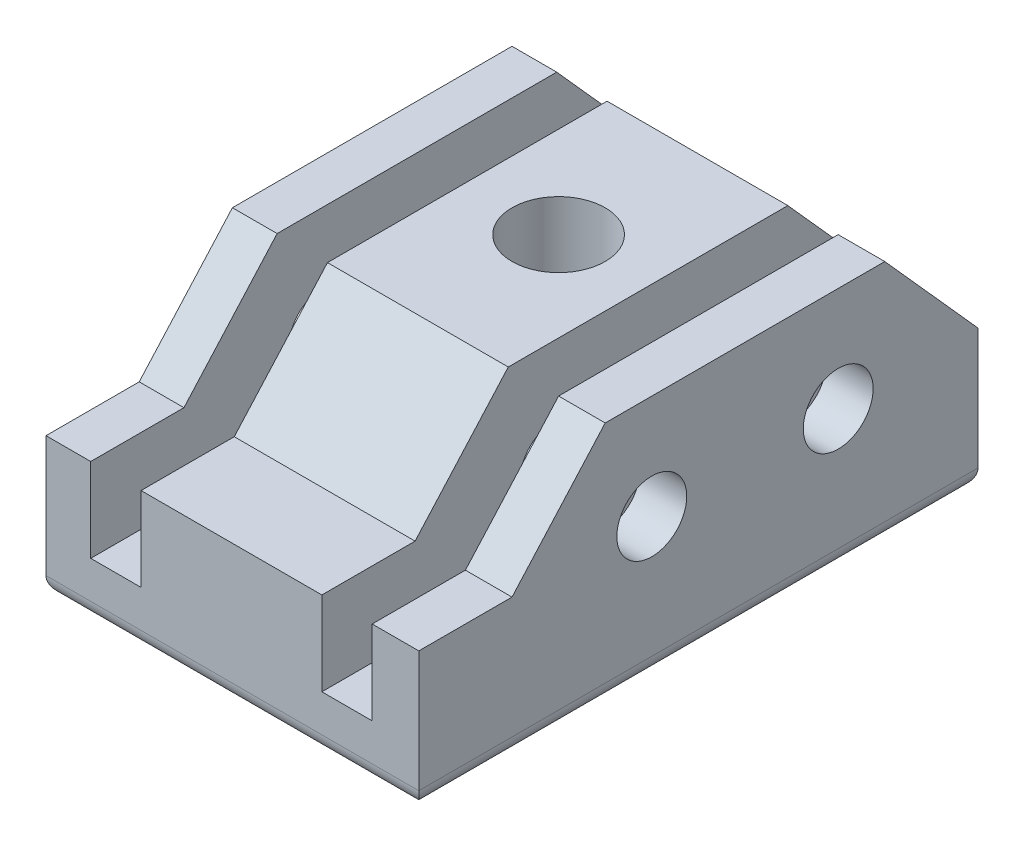
ISO-10303-21;
HEADER;
FILE_DESCRIPTION(('STEP AP214'),'2;1');
FILE_NAME('part.step','',(''),(''),'','','');
FILE_SCHEMA(('AUTOMOTIVE_DESIGN { 1 0 10303 214 1 1 1 1 }'));
ENDSEC;
DATA;
#1=APPLICATION_CONTEXT('core data for automotive mechanical design processes');
#2=APPLICATION_PROTOCOL_DEFINITION('international standard','automotive_design',2000,#1);
#3=PRODUCT_CONTEXT('',#1,'mechanical');
#4=PRODUCT('Part','Part','',(#3));
#5=PRODUCT_RELATED_PRODUCT_CATEGORY('part','',(#4));
#6=PRODUCT_DEFINITION_FORMATION('','',#4);
#7=PRODUCT_DEFINITION_CONTEXT('part definition',#1,'design');
#8=PRODUCT_DEFINITION('design','',#6,#7);
#9=PRODUCT_DEFINITION_SHAPE('','',#8);
#10=(LENGTH_UNIT() NAMED_UNIT(*) SI_UNIT(.MILLI.,.METRE.));
#11=(NAMED_UNIT(*) PLANE_ANGLE_UNIT() SI_UNIT($,.RADIAN.));
#12=(NAMED_UNIT(*) SI_UNIT($,.STERADIAN.) SOLID_ANGLE_UNIT());
#13=UNCERTAINTY_MEASURE_WITH_UNIT(LENGTH_MEASURE(1.E-05),#10,'distance_accuracy_value','');
#14=(GEOMETRIC_REPRESENTATION_CONTEXT(3) GLOBAL_UNCERTAINTY_ASSIGNED_CONTEXT((#13)) GLOBAL_UNIT_ASSIGNED_CONTEXT((#10,
#11,#12)) REPRESENTATION_CONTEXT('',''));
#15=CARTESIAN_POINT('',(0.,0.,0.));
#16=DIRECTION('',(0.,0.,1.));
#17=DIRECTION('',(1.,0.,0.));
#18=AXIS2_PLACEMENT_3D('',#15,#16,#17);
#19=CARTESIAN_POINT('',(-50.8,19.05,0.));
#20=DIRECTION('',(0.,0.666666666666667,0.74535599249993));
#21=DIRECTION('',(0.,-0.74535599249993,0.666666666666667));
#22=AXIS2_PLACEMENT_3D('',#19,#20,#21);
#23=PLANE('',#22);
#24=DIRECTION('',(0.,-0.74535599249993,0.666666666666667));
#25=VECTOR('',#24,1.);
#26=CARTESIAN_POINT('',(-44.704,19.05,0.));
#27=LINE('',#26,#25);
#28=CARTESIAN_POINT('',(-44.704,33.2490316571237,-12.7));
#29=VERTEX_POINT('',#28);
#30=CARTESIAN_POINT('',(-44.704,19.05,0.));
#31=VERTEX_POINT('',#30);
#32=EDGE_CURVE('E347',#29,#31,#27,.T.);
#33=ORIENTED_EDGE('',*,*,#32,.F.);
#34=DIRECTION('',(1.,0.,0.));
#35=VECTOR('',#34,1.);
#36=CARTESIAN_POINT('',(-50.8,33.2490316571237,-12.7));
#37=LINE('',#36,#35);
#38=CARTESIAN_POINT('',(-50.8,33.2490316571237,-12.7));
#39=VERTEX_POINT('',#38);
#40=EDGE_CURVE('E410',#39,#29,#37,.T.);
#41=ORIENTED_EDGE('',*,*,#40,.F.);
#42=DIRECTION('',(0.,-0.74535599249993,0.666666666666667));
#43=VECTOR('',#42,1.);
#44=CARTESIAN_POINT('',(-50.8,19.05,0.));
#45=LINE('',#44,#43);
#46=CARTESIAN_POINT('',(-50.8,19.05,0.));
#47=VERTEX_POINT('',#46);
#48=EDGE_CURVE('E391',#39,#47,#45,.T.);
#49=ORIENTED_EDGE('',*,*,#48,.T.);
#50=DIRECTION('',(1.,0.,0.));
#51=VECTOR('',#50,1.);
#52=CARTESIAN_POINT('',(-50.8,19.05,0.));
#53=LINE('',#52,#51);
#54=EDGE_CURVE('E403',#47,#31,#53,.T.);
#55=ORIENTED_EDGE('',*,*,#54,.T.);
#56=EDGE_LOOP('',(#33,#41,#49,#55));
#57=FACE_BOUND('',#56,.T.);
#58=ADVANCED_FACE('F41',(#57),#23,.T.);
#59=CARTESIAN_POINT('',(-50.8,33.2490316571237,-12.7));
#60=DIRECTION('',(0.,1.,0.));
#61=DIRECTION('',(0.,0.,1.));
#62=AXIS2_PLACEMENT_3D('',#59,#60,#61);
#63=PLANE('',#62);
#64=DIRECTION('',(0.,0.,-1.));
#65=VECTOR('',#64,1.);
#66=CARTESIAN_POINT('',(-44.704,33.2490316571237,0.));
#67=LINE('',#66,#65);
#68=CARTESIAN_POINT('',(-44.704,33.2490316571237,-50.8));
#69=VERTEX_POINT('',#68);
#70=EDGE_CURVE('E324',#29,#69,#67,.T.);
#71=ORIENTED_EDGE('',*,*,#70,.T.);
#72=DIRECTION('',(1.,0.,0.));
#73=VECTOR('',#72,1.);
#74=CARTESIAN_POINT('',(-50.8,33.2490316571237,-50.8));
#75=LINE('',#74,#73);
#76=CARTESIAN_POINT('',(-50.8,33.2490316571237,-50.8));
#77=VERTEX_POINT('',#76);
#78=EDGE_CURVE('E416',#77,#69,#75,.T.);
#79=ORIENTED_EDGE('',*,*,#78,.F.);
#80=DIRECTION('',(0.,0.,1.));
#81=VECTOR('',#80,1.);
#82=CARTESIAN_POINT('',(-50.8,33.2490316571237,-12.7));
#83=LINE('',#82,#81);
#84=EDGE_CURVE('E387',#77,#39,#83,.T.);
#85=ORIENTED_EDGE('',*,*,#84,.T.);
#86=ORIENTED_EDGE('',*,*,#40,.T.);
#87=EDGE_LOOP('',(#71,#79,#85,#86));
#88=FACE_BOUND('',#87,.T.);
#89=ADVANCED_FACE('F562',(#88),#63,.T.);
#90=CARTESIAN_POINT('',(-50.8,33.2490316571237,-50.8));
#91=DIRECTION('',(0.,0.666666666666666,-0.74535599249993));
#92=DIRECTION('',(0.,0.74535599249993,0.666666666666666));
#93=AXIS2_PLACEMENT_3D('',#90,#91,#92);
#94=PLANE('',#93);
#95=DIRECTION('',(0.,0.74535599249993,0.666666666666666));
#96=VECTOR('',#95,1.);
#97=CARTESIAN_POINT('',(-44.704,33.2490316571237,-50.8));
#98=LINE('',#97,#96);
#99=CARTESIAN_POINT('',(-44.704,19.05,-63.5));
#100=VERTEX_POINT('',#99);
#101=EDGE_CURVE('E344',#100,#69,#98,.T.);
#102=ORIENTED_EDGE('',*,*,#101,.F.);
#103=DIRECTION('',(1.,0.,0.));
#104=VECTOR('',#103,1.);
#105=CARTESIAN_POINT('',(-50.8,19.05,-63.5));
#106=LINE('',#105,#104);
#107=CARTESIAN_POINT('',(-50.8,19.05,-63.5));
#108=VERTEX_POINT('',#107);
#109=EDGE_CURVE('E422',#108,#100,#106,.T.);
#110=ORIENTED_EDGE('',*,*,#109,.F.);
#111=DIRECTION('',(0.,0.74535599249993,0.666666666666666));
#112=VECTOR('',#111,1.);
#113=CARTESIAN_POINT('',(-50.8,33.2490316571237,-50.8));
#114=LINE('',#113,#112);
#115=EDGE_CURVE('E383',#108,#77,#114,.T.);
#116=ORIENTED_EDGE('',*,*,#115,.T.);
#117=ORIENTED_EDGE('',*,*,#78,.T.);
#118=EDGE_LOOP('',(#102,#110,#116,#117));
#119=FACE_BOUND('',#118,.T.);
#120=ADVANCED_FACE('F570',(#119),#94,.T.);
#121=DIRECTION('',(0.,0.74535599249993,-0.666666666666667));
#122=VECTOR('',#121,1.);
#123=CARTESIAN_POINT('',(-37.846,19.05,0.));
#124=LINE('',#123,#122);
#125=CARTESIAN_POINT('',(-37.846,19.05,0.));
#126=VERTEX_POINT('',#125);
#127=CARTESIAN_POINT('',(-37.846,33.2490316571237,-12.7));
#128=VERTEX_POINT('',#127);
#129=EDGE_CURVE('E341',#126,#128,#124,.T.);
#130=ORIENTED_EDGE('',*,*,#129,.F.);
#131=CARTESIAN_POINT('',(-13.208,19.05,0.));
#132=VERTEX_POINT('',#131);
#133=EDGE_CURVE('E408',#126,#132,#53,.T.);
#134=ORIENTED_EDGE('',*,*,#133,.T.);
#135=DIRECTION('',(0.,-0.74535599249993,0.666666666666667));
#136=VECTOR('',#135,1.);
#137=CARTESIAN_POINT('',(-13.208,19.05,0.));
#138=LINE('',#137,#136);
#139=CARTESIAN_POINT('',(-13.208,33.2490316571237,-12.7));
#140=VERTEX_POINT('',#139);
#141=EDGE_CURVE('E378',#140,#132,#138,.T.);
#142=ORIENTED_EDGE('',*,*,#141,.F.);
#143=EDGE_CURVE('E414',#128,#140,#37,.T.);
#144=ORIENTED_EDGE('',*,*,#143,.F.);
#145=EDGE_LOOP('',(#130,#134,#142,#144));
#146=FACE_BOUND('',#145,.T.);
#147=ADVANCED_FACE('F565',(#146),#23,.T.);
#148=CARTESIAN_POINT('',(-25.4,33.2490316571237,-31.75));
#149=DIRECTION('',(0.,1.,0.));
#150=DIRECTION('',(0.,0.,1.));
#151=AXIS2_PLACEMENT_3D('',#148,#149,#150);
#152=CIRCLE('',#151,6.35);
#153=CARTESIAN_POINT('',(-25.4,33.2490316571237,-25.4));
#154=VERTEX_POINT('',#153);
#155=EDGE_CURVE('E483',#154,#154,#152,.T.);
#156=ORIENTED_EDGE('',*,*,#155,.F.);
#157=EDGE_LOOP('',(#156));
#158=FACE_BOUND('',#157,.T.);
#159=DIRECTION('',(0.,0.,-1.));
#160=VECTOR('',#159,1.);
#161=CARTESIAN_POINT('',(-37.846,33.2490316571237,0.));
#162=LINE('',#161,#160);
#163=CARTESIAN_POINT('',(-37.846,33.2490316571237,-50.8));
#164=VERTEX_POINT('',#163);
#165=EDGE_CURVE('E333',#128,#164,#162,.T.);
#166=ORIENTED_EDGE('',*,*,#165,.F.);
#167=ORIENTED_EDGE('',*,*,#143,.T.);
#168=DIRECTION('',(0.,0.,-1.));
#169=VECTOR('',#168,1.);
#170=CARTESIAN_POINT('',(-13.208,33.2490316571237,0.));
#171=LINE('',#170,#169);
#172=CARTESIAN_POINT('',(-13.208,33.2490316571237,-50.8));
#173=VERTEX_POINT('',#172);
#174=EDGE_CURVE('E361',#140,#173,#171,.T.);
#175=ORIENTED_EDGE('',*,*,#174,.T.);
#176=EDGE_CURVE('E420',#164,#173,#75,.T.);
#177=ORIENTED_EDGE('',*,*,#176,.F.);
#178=EDGE_LOOP('',(#166,#167,#175,#177));
#179=FACE_BOUND('',#178,.T.);
#180=ADVANCED_FACE('F573',(#158,#179),#63,.T.);
#181=DIRECTION('',(0.,-0.74535599249993,-0.666666666666666));
#182=VECTOR('',#181,1.);
#183=CARTESIAN_POINT('',(-37.846,33.2490316571237,-50.8));
#184=LINE('',#183,#182);
#185=CARTESIAN_POINT('',(-37.846,19.05,-63.5));
#186=VERTEX_POINT('',#185);
#187=EDGE_CURVE('E328',#164,#186,#184,.T.);
#188=ORIENTED_EDGE('',*,*,#187,.F.);
#189=ORIENTED_EDGE('',*,*,#176,.T.);
#190=DIRECTION('',(0.,0.74535599249993,0.666666666666666));
#191=VECTOR('',#190,1.);
#192=CARTESIAN_POINT('',(-13.208,33.2490316571237,-50.8));
#193=LINE('',#192,#191);
#194=CARTESIAN_POINT('',(-13.208,19.05,-63.5));
#195=VERTEX_POINT('',#194);
#196=EDGE_CURVE('E435',#195,#173,#193,.T.);
#197=ORIENTED_EDGE('',*,*,#196,.F.);
#198=EDGE_CURVE('E426',#186,#195,#106,.T.);
#199=ORIENTED_EDGE('',*,*,#198,.F.);
#200=EDGE_LOOP('',(#188,#189,#197,#199));
#201=FACE_BOUND('',#200,.T.);
#202=ADVANCED_FACE('F656',(#201),#94,.T.);
#203=CARTESIAN_POINT('',(-50.8,0.,-63.5));
#204=DIRECTION('',(0.,0.,-1.));
#205=DIRECTION('',(-1.,0.,0.));
#206=AXIS2_PLACEMENT_3D('',#203,#204,#205);
#207=PLANE('',#206);
#208=DIRECTION('',(0.,1.,0.));
#209=VECTOR('',#208,1.);
#210=CARTESIAN_POINT('',(0.,0.,-63.5));
#211=LINE('',#210,#209);
#212=CARTESIAN_POINT('',(0.,2.54,-63.5));
#213=VERTEX_POINT('',#212);
#214=CARTESIAN_POINT('',(0.,19.05,-63.5));
#215=VERTEX_POINT('',#214);
#216=EDGE_CURVE('E407',#213,#215,#211,.T.);
#217=ORIENTED_EDGE('',*,*,#216,.F.);
#218=DIRECTION('',(1.,0.,0.));
#219=VECTOR('',#218,1.);
#220=CARTESIAN_POINT('',(-50.8,2.54,-63.5));
#221=LINE('',#220,#219);
#222=CARTESIAN_POINT('',(-50.8,2.54,-63.5));
#223=VERTEX_POINT('',#222);
#224=EDGE_CURVE('E461',#213,#223,#221,.F.);
#225=ORIENTED_EDGE('',*,*,#224,.T.);
#226=DIRECTION('',(0.,1.,0.));
#227=VECTOR('',#226,1.);
#228=CARTESIAN_POINT('',(-50.8,0.,-63.5));
#229=LINE('',#228,#227);
#230=EDGE_CURVE('E427',#223,#108,#229,.T.);
#231=ORIENTED_EDGE('',*,*,#230,.T.);
#232=ORIENTED_EDGE('',*,*,#109,.T.);
#233=DIRECTION('',(0.,1.,0.));
#234=VECTOR('',#233,1.);
#235=CARTESIAN_POINT('',(-44.704,7.62,-63.5));
#236=LINE('',#235,#234);
#237=CARTESIAN_POINT('',(-44.704,7.62,-63.5));
#238=VERTEX_POINT('',#237);
#239=EDGE_CURVE('E317',#238,#100,#236,.T.);
#240=ORIENTED_EDGE('',*,*,#239,.F.);
#241=DIRECTION('',(-1.,0.,0.));
#242=VECTOR('',#241,1.);
#243=CARTESIAN_POINT('',(-37.846,7.62,-63.5));
#244=LINE('',#243,#242);
#245=CARTESIAN_POINT('',(-37.846,7.62,-63.5));
#246=VERTEX_POINT('',#245);
#247=EDGE_CURVE('E320',#246,#238,#244,.T.);
#248=ORIENTED_EDGE('',*,*,#247,.F.);
#249=DIRECTION('',(0.,-1.,0.));
#250=VECTOR('',#249,1.);
#251=CARTESIAN_POINT('',(-37.846,0.,-63.5));
#252=LINE('',#251,#250);
#253=EDGE_CURVE('E439',#186,#246,#252,.T.);
#254=ORIENTED_EDGE('',*,*,#253,.F.);
#255=ORIENTED_EDGE('',*,*,#198,.T.);
#256=DIRECTION('',(0.,1.,0.));
#257=VECTOR('',#256,1.);
#258=CARTESIAN_POINT('',(-13.208,7.62,-63.5));
#259=LINE('',#258,#257);
#260=CARTESIAN_POINT('',(-13.208,7.62,-63.5));
#261=VERTEX_POINT('',#260);
#262=EDGE_CURVE('E350',#261,#195,#259,.T.);
#263=ORIENTED_EDGE('',*,*,#262,.F.);
#264=DIRECTION('',(-1.,0.,0.));
#265=VECTOR('',#264,1.);
#266=CARTESIAN_POINT('',(-6.35,7.62,-63.5));
#267=LINE('',#266,#265);
#268=CARTESIAN_POINT('',(-6.35,7.62,-63.5));
#269=VERTEX_POINT('',#268);
#270=EDGE_CURVE('E357',#269,#261,#267,.T.);
#271=ORIENTED_EDGE('',*,*,#270,.F.);
#272=DIRECTION('',(0.,-1.,0.));
#273=VECTOR('',#272,1.);
#274=CARTESIAN_POINT('',(-6.35,7.62,-63.5));
#275=LINE('',#274,#273);
#276=CARTESIAN_POINT('',(-6.35,19.05,-63.5));
#277=VERTEX_POINT('',#276);
#278=EDGE_CURVE('E354',#277,#269,#275,.T.);
#279=ORIENTED_EDGE('',*,*,#278,.F.);
#280=EDGE_CURVE('E394',#277,#215,#106,.T.);
#281=ORIENTED_EDGE('',*,*,#280,.T.);
#282=EDGE_LOOP('',(#217,#225,#231,#232,#240,#248,#254,#255,#263,#271,#279,#281));
#283=FACE_BOUND('',#282,.T.);
#284=ADVANCED_FACE('F540',(#283),#207,.T.);
#285=CARTESIAN_POINT('',(-50.8,0.,0.));
#286=DIRECTION('',(0.,-1.,0.));
#287=DIRECTION('',(0.,0.,-1.));
#288=AXIS2_PLACEMENT_3D('',#285,#286,#287);
#289=PLANE('',#288);
#290=CARTESIAN_POINT('',(-30.4,0.,3.34999999999999));
#291=DIRECTION('',(0.,-1.,0.));
#292=DIRECTION('',(0.,0.,-1.));
#293=AXIS2_PLACEMENT_3D('',#290,#291,#292);
#294=CIRCLE('',#293,3.05);
#295=CARTESIAN_POINT('',(-30.4,0.,0.29999999999999));
#296=VERTEX_POINT('',#295);
#297=EDGE_CURVE('E503',#296,#296,#294,.T.);
#298=ORIENTED_EDGE('',*,*,#297,.F.);
#299=EDGE_LOOP('',(#298));
#300=FACE_BOUND('',#299,.T.);
#301=CARTESIAN_POINT('',(-20.4,0.,3.34999999999999));
#302=DIRECTION('',(0.,-1.,0.));
#303=DIRECTION('',(0.,0.,-1.));
#304=AXIS2_PLACEMENT_3D('',#301,#302,#303);
#305=CIRCLE('',#304,3.05);
#306=CARTESIAN_POINT('',(-20.4,0.,0.29999999999999));
#307=VERTEX_POINT('',#306);
#308=EDGE_CURVE('E511',#307,#307,#305,.T.);
#309=ORIENTED_EDGE('',*,*,#308,.F.);
#310=EDGE_LOOP('',(#309));
#311=FACE_BOUND('',#310,.T.);
#312=CARTESIAN_POINT('',(-20.4,0.,-46.15));
#313=DIRECTION('',(0.,-1.,0.));
#314=DIRECTION('',(0.,0.,-1.));
#315=AXIS2_PLACEMENT_3D('',#312,#313,#314);
#316=CIRCLE('',#315,3.05);
#317=CARTESIAN_POINT('',(-20.4,0.,-49.2));
#318=VERTEX_POINT('',#317);
#319=EDGE_CURVE('E519',#318,#318,#316,.T.);
#320=ORIENTED_EDGE('',*,*,#319,.F.);
#321=EDGE_LOOP('',(#320));
#322=FACE_BOUND('',#321,.T.);
#323=CARTESIAN_POINT('',(-30.4,0.,-46.15));
#324=DIRECTION('',(0.,-1.,0.));
#325=DIRECTION('',(0.,0.,-1.));
#326=AXIS2_PLACEMENT_3D('',#323,#324,#325);
#327=CIRCLE('',#326,3.05);
#328=CARTESIAN_POINT('',(-30.4,0.,-49.2));
#329=VERTEX_POINT('',#328);
#330=EDGE_CURVE('E495',#329,#329,#327,.T.);
#331=ORIENTED_EDGE('',*,*,#330,.F.);
#332=EDGE_LOOP('',(#331));
#333=FACE_BOUND('',#332,.T.);
#334=DIRECTION('',(0.,0.,-1.));
#335=VECTOR('',#334,1.);
#336=CARTESIAN_POINT('',(-48.26,0.,0.));
#337=LINE('',#336,#335);
#338=CARTESIAN_POINT('',(-48.26,0.,10.16));
#339=VERTEX_POINT('',#338);
#340=CARTESIAN_POINT('',(-48.26,0.,-60.96));
#341=VERTEX_POINT('',#340);
#342=EDGE_CURVE('E454',#339,#341,#337,.T.);
#343=ORIENTED_EDGE('',*,*,#342,.T.);
#344=DIRECTION('',(1.,0.,0.));
#345=VECTOR('',#344,1.);
#346=CARTESIAN_POINT('',(-50.8,0.,-60.96));
#347=LINE('',#346,#345);
#348=CARTESIAN_POINT('',(-2.54,0.,-60.96));
#349=VERTEX_POINT('',#348);
#350=EDGE_CURVE('E457',#341,#349,#347,.T.);
#351=ORIENTED_EDGE('',*,*,#350,.T.);
#352=DIRECTION('',(0.,0.,-1.));
#353=VECTOR('',#352,1.);
#354=CARTESIAN_POINT('',(-2.54,0.,12.7));
#355=LINE('',#354,#353);
#356=CARTESIAN_POINT('',(-2.54,0.,10.16));
#357=VERTEX_POINT('',#356);
#358=EDGE_CURVE('E442',#349,#357,#355,.F.);
#359=ORIENTED_EDGE('',*,*,#358,.T.);
#360=DIRECTION('',(1.,0.,0.));
#361=VECTOR('',#360,1.);
#362=CARTESIAN_POINT('',(-50.8,0.,10.16));
#363=LINE('',#362,#361);
#364=EDGE_CURVE('E451',#357,#339,#363,.F.);
#365=ORIENTED_EDGE('',*,*,#364,.T.);
#366=EDGE_LOOP('',(#343,#351,#359,#365));
#367=FACE_BOUND('',#366,.T.);
#368=CARTESIAN_POINT('',(-25.4,0.,-31.75));
#369=DIRECTION('',(0.,1.,0.));
#370=DIRECTION('',(0.,0.,1.));
#371=AXIS2_PLACEMENT_3D('',#368,#369,#370);
#372=CIRCLE('',#371,6.35);
#373=CARTESIAN_POINT('',(-25.4,0.,-25.4));
#374=VERTEX_POINT('',#373);
#375=EDGE_CURVE('E206',#374,#374,#372,.T.);
#376=ORIENTED_EDGE('',*,*,#375,.T.);
#377=EDGE_LOOP('',(#376));
#378=FACE_BOUND('',#377,.T.);
#379=ADVANCED_FACE('F536',(#300,#311,#322,#333,#367,#378),#289,.T.);
#380=CARTESIAN_POINT('',(-50.8,0.,0.));
#381=DIRECTION('',(-1.,0.,0.));
#382=DIRECTION('',(0.,0.,1.));
#383=AXIS2_PLACEMENT_3D('',#380,#381,#382);
#384=PLANE('',#383);
#385=CARTESIAN_POINT('',(-50.8,19.05,-19.05));
#386=DIRECTION('',(1.,0.,0.));
#387=DIRECTION('',(0.,0.,-1.));
#388=AXIS2_PLACEMENT_3D('',#385,#386,#387);
#389=CIRCLE('',#388,4.7625);
#390=CARTESIAN_POINT('',(-50.8,19.05,-23.8125));
#391=VERTEX_POINT('',#390);
#392=EDGE_CURVE('E276',#391,#391,#389,.T.);
#393=ORIENTED_EDGE('',*,*,#392,.T.);
#394=EDGE_LOOP('',(#393));
#395=FACE_BOUND('',#394,.T.);
#396=CARTESIAN_POINT('',(-50.8,19.05,-44.45));
#397=DIRECTION('',(1.,0.,0.));
#398=DIRECTION('',(0.,0.,-1.));
#399=AXIS2_PLACEMENT_3D('',#396,#397,#398);
#400=CIRCLE('',#399,4.7625);
#401=CARTESIAN_POINT('',(-50.8,19.05,-49.2125));
#402=VERTEX_POINT('',#401);
#403=EDGE_CURVE('E285',#402,#402,#400,.T.);
#404=ORIENTED_EDGE('',*,*,#403,.T.);
#405=EDGE_LOOP('',(#404));
#406=FACE_BOUND('',#405,.T.);
#407=ORIENTED_EDGE('',*,*,#230,.F.);
#408=DIRECTION('',(0.,0.,-1.));
#409=VECTOR('',#408,1.);
#410=CARTESIAN_POINT('',(-50.8,2.54,0.));
#411=LINE('',#410,#409);
#412=CARTESIAN_POINT('',(-50.8,2.54,12.7));
#413=VERTEX_POINT('',#412);
#414=EDGE_CURVE('E66',#223,#413,#411,.F.);
#415=ORIENTED_EDGE('',*,*,#414,.T.);
#416=DIRECTION('',(0.,-1.,0.));
#417=VECTOR('',#416,1.);
#418=CARTESIAN_POINT('',(-50.8,7.61999999999999,12.7));
#419=LINE('',#418,#417);
#420=CARTESIAN_POINT('',(-50.8,19.05,12.7));
#421=VERTEX_POINT('',#420);
#422=EDGE_CURVE('E255',#421,#413,#419,.T.);
#423=ORIENTED_EDGE('',*,*,#422,.F.);
#424=DIRECTION('',(0.,0.,-1.));
#425=VECTOR('',#424,1.);
#426=CARTESIAN_POINT('',(-50.8,19.05,12.7));
#427=LINE('',#426,#425);
#428=EDGE_CURVE('E258',#421,#47,#427,.T.);
#429=ORIENTED_EDGE('',*,*,#428,.T.);
#430=ORIENTED_EDGE('',*,*,#48,.F.);
#431=ORIENTED_EDGE('',*,*,#84,.F.);
#432=ORIENTED_EDGE('',*,*,#115,.F.);
#433=EDGE_LOOP('',(#407,#415,#423,#429,#430,#431,#432));
#434=FACE_BOUND('',#433,.T.);
#435=ADVANCED_FACE('F539',(#395,#406,#434),#384,.T.);
#436=CARTESIAN_POINT('',(0.,0.,0.));
#437=DIRECTION('',(-1.,0.,0.));
#438=DIRECTION('',(0.,0.,1.));
#439=AXIS2_PLACEMENT_3D('',#436,#437,#438);
#440=PLANE('',#439);
#441=CARTESIAN_POINT('',(0.,19.05,-19.05));
#442=DIRECTION('',(1.,0.,0.));
#443=DIRECTION('',(0.,0.,-1.));
#444=AXIS2_PLACEMENT_3D('',#441,#442,#443);
#445=CIRCLE('',#444,4.7625);
#446=CARTESIAN_POINT('',(0.,19.05,-23.8125));
#447=VERTEX_POINT('',#446);
#448=EDGE_CURVE('E281',#447,#447,#445,.T.);
#449=ORIENTED_EDGE('',*,*,#448,.F.);
#450=EDGE_LOOP('',(#449));
#451=FACE_BOUND('',#450,.T.);
#452=CARTESIAN_POINT('',(0.,19.05,-44.45));
#453=DIRECTION('',(1.,0.,0.));
#454=DIRECTION('',(0.,0.,-1.));
#455=AXIS2_PLACEMENT_3D('',#452,#453,#454);
#456=CIRCLE('',#455,4.7625);
#457=CARTESIAN_POINT('',(0.,19.05,-49.2125));
#458=VERTEX_POINT('',#457);
#459=EDGE_CURVE('E218',#458,#458,#456,.T.);
#460=ORIENTED_EDGE('',*,*,#459,.F.);
#461=EDGE_LOOP('',(#460));
#462=FACE_BOUND('',#461,.T.);
#463=DIRECTION('',(0.,1.,0.));
#464=VECTOR('',#463,1.);
#465=CARTESIAN_POINT('',(0.,0.,12.7));
#466=LINE('',#465,#464);
#467=CARTESIAN_POINT('',(0.,2.54,12.7));
#468=VERTEX_POINT('',#467);
#469=CARTESIAN_POINT('',(0.,19.05,12.7));
#470=VERTEX_POINT('',#469);
#471=EDGE_CURVE('E196',#468,#470,#466,.T.);
#472=ORIENTED_EDGE('',*,*,#471,.F.);
#473=DIRECTION('',(0.,0.,-1.));
#474=VECTOR('',#473,1.);
#475=CARTESIAN_POINT('',(0.,2.54,-63.5));
#476=LINE('',#475,#474);
#477=EDGE_CURVE('E11',#468,#213,#476,.T.);
#478=ORIENTED_EDGE('',*,*,#477,.T.);
#479=ORIENTED_EDGE('',*,*,#216,.T.);
#480=DIRECTION('',(0.,0.74535599249993,0.666666666666666));
#481=VECTOR('',#480,1.);
#482=CARTESIAN_POINT('',(0.,33.2490316571237,-50.8));
#483=LINE('',#482,#481);
#484=CARTESIAN_POINT('',(0.,33.2490316571237,-50.8));
#485=VERTEX_POINT('',#484);
#486=EDGE_CURVE('E382',#215,#485,#483,.T.);
#487=ORIENTED_EDGE('',*,*,#486,.T.);
#488=DIRECTION('',(0.,0.,1.));
#489=VECTOR('',#488,1.);
#490=CARTESIAN_POINT('',(0.,33.2490316571237,-12.7));
#491=LINE('',#490,#489);
#492=CARTESIAN_POINT('',(0.,33.2490316571237,-12.7));
#493=VERTEX_POINT('',#492);
#494=EDGE_CURVE('E398',#485,#493,#491,.T.);
#495=ORIENTED_EDGE('',*,*,#494,.T.);
#496=DIRECTION('',(0.,-0.74535599249993,0.666666666666667));
#497=VECTOR('',#496,1.);
#498=CARTESIAN_POINT('',(0.,19.05,0.));
#499=LINE('',#498,#497);
#500=CARTESIAN_POINT('',(0.,19.05,0.));
#501=VERTEX_POINT('',#500);
#502=EDGE_CURVE('E214',#493,#501,#499,.T.);
#503=ORIENTED_EDGE('',*,*,#502,.T.);
#504=DIRECTION('',(0.,0.,-1.));
#505=VECTOR('',#504,1.);
#506=CARTESIAN_POINT('',(0.,19.05,12.7));
#507=LINE('',#506,#505);
#508=EDGE_CURVE('E210',#470,#501,#507,.T.);
#509=ORIENTED_EDGE('',*,*,#508,.F.);
#510=EDGE_LOOP('',(#472,#478,#479,#487,#495,#503,#509));
#511=FACE_BOUND('',#510,.T.);
#512=ADVANCED_FACE('F211',(#451,#462,#511),#440,.F.);
#513=DIRECTION('',(0.,0.74535599249993,-0.666666666666667));
#514=VECTOR('',#513,1.);
#515=CARTESIAN_POINT('',(-6.35,19.05,0.));
#516=LINE('',#515,#514);
#517=CARTESIAN_POINT('',(-6.35,19.05,0.));
#518=VERTEX_POINT('',#517);
#519=CARTESIAN_POINT('',(-6.35,33.2490316571237,-12.7));
#520=VERTEX_POINT('',#519);
#521=EDGE_CURVE('E365',#518,#520,#516,.T.);
#522=ORIENTED_EDGE('',*,*,#521,.F.);
#523=EDGE_CURVE('E409',#518,#501,#53,.T.);
#524=ORIENTED_EDGE('',*,*,#523,.T.);
#525=ORIENTED_EDGE('',*,*,#502,.F.);
#526=EDGE_CURVE('E415',#520,#493,#37,.T.);
#527=ORIENTED_EDGE('',*,*,#526,.F.);
#528=EDGE_LOOP('',(#522,#524,#525,#527));
#529=FACE_BOUND('',#528,.T.);
#530=ADVANCED_FACE('F566',(#529),#23,.T.);
#531=DIRECTION('',(0.,0.,-1.));
#532=VECTOR('',#531,1.);
#533=CARTESIAN_POINT('',(-6.35,33.2490316571237,0.));
#534=LINE('',#533,#532);
#535=CARTESIAN_POINT('',(-6.35,33.2490316571237,-50.8));
#536=VERTEX_POINT('',#535);
#537=EDGE_CURVE('E370',#520,#536,#534,.T.);
#538=ORIENTED_EDGE('',*,*,#537,.F.);
#539=ORIENTED_EDGE('',*,*,#526,.T.);
#540=ORIENTED_EDGE('',*,*,#494,.F.);
#541=EDGE_CURVE('E421',#536,#485,#75,.T.);
#542=ORIENTED_EDGE('',*,*,#541,.F.);
#543=EDGE_LOOP('',(#538,#539,#540,#542));
#544=FACE_BOUND('',#543,.T.);
#545=ADVANCED_FACE('F574',(#544),#63,.T.);
#546=DIRECTION('',(0.,-0.74535599249993,-0.666666666666666));
#547=VECTOR('',#546,1.);
#548=CARTESIAN_POINT('',(-6.35,33.2490316571237,-50.8));
#549=LINE('',#548,#547);
#550=EDGE_CURVE('E430',#536,#277,#549,.T.);
#551=ORIENTED_EDGE('',*,*,#550,.F.);
#552=ORIENTED_EDGE('',*,*,#541,.T.);
#553=ORIENTED_EDGE('',*,*,#486,.F.);
#554=ORIENTED_EDGE('',*,*,#280,.F.);
#555=EDGE_LOOP('',(#551,#552,#553,#554));
#556=FACE_BOUND('',#555,.T.);
#557=ADVANCED_FACE('F585',(#556),#94,.T.);
#558=CARTESIAN_POINT('',(-13.208,7.62,0.));
#559=DIRECTION('',(-1.,0.,0.));
#560=DIRECTION('',(0.,-1.,0.));
#561=AXIS2_PLACEMENT_3D('',#558,#559,#560);
#562=PLANE('',#561);
#563=CARTESIAN_POINT('',(-13.208,19.05,-19.05));
#564=DIRECTION('',(-1.,0.,0.));
#565=DIRECTION('',(0.,-1.,0.));
#566=AXIS2_PLACEMENT_3D('',#563,#564,#565);
#567=CIRCLE('',#566,4.7625);
#568=CARTESIAN_POINT('',(-13.208,14.2875,-19.05));
#569=VERTEX_POINT('',#568);
#570=EDGE_CURVE('E313',#569,#569,#567,.T.);
#571=ORIENTED_EDGE('',*,*,#570,.T.);
#572=EDGE_LOOP('',(#571));
#573=FACE_BOUND('',#572,.T.);
#574=CARTESIAN_POINT('',(-13.208,19.05,-44.45));
#575=DIRECTION('',(-1.,0.,0.));
#576=DIRECTION('',(0.,-1.,0.));
#577=AXIS2_PLACEMENT_3D('',#574,#575,#576);
#578=CIRCLE('',#577,4.7625);
#579=CARTESIAN_POINT('',(-13.208,14.2875,-44.45));
#580=VERTEX_POINT('',#579);
#581=EDGE_CURVE('E300',#580,#580,#578,.T.);
#582=ORIENTED_EDGE('',*,*,#581,.T.);
#583=EDGE_LOOP('',(#582));
#584=FACE_BOUND('',#583,.T.);
#585=ORIENTED_EDGE('',*,*,#141,.T.);
#586=DIRECTION('',(0.,0.,-1.));
#587=VECTOR('',#586,1.);
#588=CARTESIAN_POINT('',(-13.208,19.05,12.7));
#589=LINE('',#588,#587);
#590=CARTESIAN_POINT('',(-13.208,19.05,12.7));
#591=VERTEX_POINT('',#590);
#592=EDGE_CURVE('E270',#591,#132,#589,.T.);
#593=ORIENTED_EDGE('',*,*,#592,.F.);
#594=DIRECTION('',(0.,1.,0.));
#595=VECTOR('',#594,1.);
#596=CARTESIAN_POINT('',(-13.208,19.05,12.7));
#597=LINE('',#596,#595);
#598=CARTESIAN_POINT('',(-13.208,7.62,12.7));
#599=VERTEX_POINT('',#598);
#600=EDGE_CURVE('E235',#599,#591,#597,.T.);
#601=ORIENTED_EDGE('',*,*,#600,.F.);
#602=DIRECTION('',(0.,0.,-1.));
#603=VECTOR('',#602,1.);
#604=CARTESIAN_POINT('',(-13.208,7.62,0.));
#605=LINE('',#604,#603);
#606=EDGE_CURVE('E362',#599,#261,#605,.T.);
#607=ORIENTED_EDGE('',*,*,#606,.T.);
#608=ORIENTED_EDGE('',*,*,#262,.T.);
#609=ORIENTED_EDGE('',*,*,#196,.T.);
#610=ORIENTED_EDGE('',*,*,#174,.F.);
#611=EDGE_LOOP('',(#585,#593,#601,#607,#608,#609,#610));
#612=FACE_BOUND('',#611,.T.);
#613=ADVANCED_FACE('F601',(#573,#584,#612),#562,.F.);
#614=CARTESIAN_POINT('',(-6.35,7.62,0.));
#615=DIRECTION('',(0.,-1.,0.));
#616=DIRECTION('',(0.,0.,-1.));
#617=AXIS2_PLACEMENT_3D('',#614,#615,#616);
#618=PLANE('',#617);
#619=ORIENTED_EDGE('',*,*,#270,.T.);
#620=ORIENTED_EDGE('',*,*,#606,.F.);
#621=DIRECTION('',(-1.,0.,0.));
#622=VECTOR('',#621,1.);
#623=CARTESIAN_POINT('',(-6.35,7.62,12.7));
#624=LINE('',#623,#622);
#625=CARTESIAN_POINT('',(-6.35,7.62,12.7));
#626=VERTEX_POINT('',#625);
#627=EDGE_CURVE('E228',#626,#599,#624,.T.);
#628=ORIENTED_EDGE('',*,*,#627,.F.);
#629=DIRECTION('',(0.,0.,-1.));
#630=VECTOR('',#629,1.);
#631=CARTESIAN_POINT('',(-6.35,7.62,0.));
#632=LINE('',#631,#630);
#633=EDGE_CURVE('E366',#626,#269,#632,.T.);
#634=ORIENTED_EDGE('',*,*,#633,.T.);
#635=EDGE_LOOP('',(#619,#620,#628,#634));
#636=FACE_BOUND('',#635,.T.);
#637=ADVANCED_FACE('F597',(#636),#618,.F.);
#638=CARTESIAN_POINT('',(-6.35,7.62,0.));
#639=DIRECTION('',(1.,0.,0.));
#640=DIRECTION('',(0.,0.,-1.));
#641=AXIS2_PLACEMENT_3D('',#638,#639,#640);
#642=PLANE('',#641);
#643=CARTESIAN_POINT('',(-6.35,19.05,-19.05));
#644=DIRECTION('',(1.,0.,0.));
#645=DIRECTION('',(0.,0.,-1.));
#646=AXIS2_PLACEMENT_3D('',#643,#644,#645);
#647=CIRCLE('',#646,4.7625);
#648=CARTESIAN_POINT('',(-6.35,19.05,-23.8125));
#649=VERTEX_POINT('',#648);
#650=EDGE_CURVE('E309',#649,#649,#647,.T.);
#651=ORIENTED_EDGE('',*,*,#650,.T.);
#652=EDGE_LOOP('',(#651));
#653=FACE_BOUND('',#652,.T.);
#654=CARTESIAN_POINT('',(-6.35,19.05,-44.45));
#655=DIRECTION('',(1.,0.,0.));
#656=DIRECTION('',(0.,0.,-1.));
#657=AXIS2_PLACEMENT_3D('',#654,#655,#656);
#658=CIRCLE('',#657,4.7625);
#659=CARTESIAN_POINT('',(-6.35,19.05,-49.2125));
#660=VERTEX_POINT('',#659);
#661=EDGE_CURVE('E296',#660,#660,#658,.T.);
#662=ORIENTED_EDGE('',*,*,#661,.T.);
#663=EDGE_LOOP('',(#662));
#664=FACE_BOUND('',#663,.T.);
#665=ORIENTED_EDGE('',*,*,#521,.T.);
#666=ORIENTED_EDGE('',*,*,#537,.T.);
#667=ORIENTED_EDGE('',*,*,#550,.T.);
#668=ORIENTED_EDGE('',*,*,#278,.T.);
#669=ORIENTED_EDGE('',*,*,#633,.F.);
#670=DIRECTION('',(0.,-1.,0.));
#671=VECTOR('',#670,1.);
#672=CARTESIAN_POINT('',(-6.35,7.62,12.7));
#673=LINE('',#672,#671);
#674=CARTESIAN_POINT('',(-6.35,19.05,12.7));
#675=VERTEX_POINT('',#674);
#676=EDGE_CURVE('E225',#675,#626,#673,.T.);
#677=ORIENTED_EDGE('',*,*,#676,.F.);
#678=DIRECTION('',(0.,0.,-1.));
#679=VECTOR('',#678,1.);
#680=CARTESIAN_POINT('',(-6.35,19.05,12.7));
#681=LINE('',#680,#679);
#682=EDGE_CURVE('E219',#675,#518,#681,.T.);
#683=ORIENTED_EDGE('',*,*,#682,.T.);
#684=EDGE_LOOP('',(#665,#666,#667,#668,#669,#677,#683));
#685=FACE_BOUND('',#684,.T.);
#686=ADVANCED_FACE('F593',(#653,#664,#685),#642,.F.);
#687=CARTESIAN_POINT('',(-44.704,7.62,0.));
#688=DIRECTION('',(-1.,0.,0.));
#689=DIRECTION('',(0.,-1.,0.));
#690=AXIS2_PLACEMENT_3D('',#687,#688,#689);
#691=PLANE('',#690);
#692=CARTESIAN_POINT('',(-44.704,19.05,-19.05));
#693=DIRECTION('',(-1.,0.,0.));
#694=DIRECTION('',(0.,-1.,0.));
#695=AXIS2_PLACEMENT_3D('',#692,#693,#694);
#696=CIRCLE('',#695,4.7625);
#697=CARTESIAN_POINT('',(-44.704,14.2875,-19.05));
#698=VERTEX_POINT('',#697);
#699=EDGE_CURVE('E305',#698,#698,#696,.T.);
#700=ORIENTED_EDGE('',*,*,#699,.T.);
#701=EDGE_LOOP('',(#700));
#702=FACE_BOUND('',#701,.T.);
#703=CARTESIAN_POINT('',(-44.704,19.05,-44.45));
#704=DIRECTION('',(-1.,0.,0.));
#705=DIRECTION('',(0.,-1.,0.));
#706=AXIS2_PLACEMENT_3D('',#703,#704,#705);
#707=CIRCLE('',#706,4.7625);
#708=CARTESIAN_POINT('',(-44.704,14.2875,-44.45));
#709=VERTEX_POINT('',#708);
#710=EDGE_CURVE('E292',#709,#709,#707,.T.);
#711=ORIENTED_EDGE('',*,*,#710,.T.);
#712=EDGE_LOOP('',(#711));
#713=FACE_BOUND('',#712,.T.);
#714=ORIENTED_EDGE('',*,*,#32,.T.);
#715=DIRECTION('',(0.,0.,-1.));
#716=VECTOR('',#715,1.);
#717=CARTESIAN_POINT('',(-44.704,19.05,12.7));
#718=LINE('',#717,#716);
#719=CARTESIAN_POINT('',(-44.704,19.05,12.7));
#720=VERTEX_POINT('',#719);
#721=EDGE_CURVE('E262',#720,#31,#718,.T.);
#722=ORIENTED_EDGE('',*,*,#721,.F.);
#723=DIRECTION('',(0.,1.,0.));
#724=VECTOR('',#723,1.);
#725=CARTESIAN_POINT('',(-44.704,19.05,12.7));
#726=LINE('',#725,#724);
#727=CARTESIAN_POINT('',(-44.704,7.62,12.7));
#728=VERTEX_POINT('',#727);
#729=EDGE_CURVE('E249',#728,#720,#726,.T.);
#730=ORIENTED_EDGE('',*,*,#729,.F.);
#731=DIRECTION('',(0.,0.,-1.));
#732=VECTOR('',#731,1.);
#733=CARTESIAN_POINT('',(-44.704,7.62,0.));
#734=LINE('',#733,#732);
#735=EDGE_CURVE('E325',#728,#238,#734,.T.);
#736=ORIENTED_EDGE('',*,*,#735,.T.);
#737=ORIENTED_EDGE('',*,*,#239,.T.);
#738=ORIENTED_EDGE('',*,*,#101,.T.);
#739=ORIENTED_EDGE('',*,*,#70,.F.);
#740=EDGE_LOOP('',(#714,#722,#730,#736,#737,#738,#739));
#741=FACE_BOUND('',#740,.T.);
#742=ADVANCED_FACE('F624',(#702,#713,#741),#691,.F.);
#743=CARTESIAN_POINT('',(-37.846,7.62,0.));
#744=DIRECTION('',(0.,-1.,0.));
#745=DIRECTION('',(0.,0.,-1.));
#746=AXIS2_PLACEMENT_3D('',#743,#744,#745);
#747=PLANE('',#746);
#748=ORIENTED_EDGE('',*,*,#247,.T.);
#749=ORIENTED_EDGE('',*,*,#735,.F.);
#750=DIRECTION('',(-1.,0.,0.));
#751=VECTOR('',#750,1.);
#752=CARTESIAN_POINT('',(-37.846,7.62,12.7));
#753=LINE('',#752,#751);
#754=CARTESIAN_POINT('',(-37.846,7.62,12.7));
#755=VERTEX_POINT('',#754);
#756=EDGE_CURVE('E245',#755,#728,#753,.T.);
#757=ORIENTED_EDGE('',*,*,#756,.F.);
#758=DIRECTION('',(0.,0.,-1.));
#759=VECTOR('',#758,1.);
#760=CARTESIAN_POINT('',(-37.846,7.62,0.));
#761=LINE('',#760,#759);
#762=EDGE_CURVE('E329',#755,#246,#761,.T.);
#763=ORIENTED_EDGE('',*,*,#762,.T.);
#764=EDGE_LOOP('',(#748,#749,#757,#763));
#765=FACE_BOUND('',#764,.T.);
#766=ADVANCED_FACE('F616',(#765),#747,.F.);
#767=CARTESIAN_POINT('',(-37.846,7.62,0.));
#768=DIRECTION('',(1.,0.,0.));
#769=DIRECTION('',(0.,0.,-1.));
#770=AXIS2_PLACEMENT_3D('',#767,#768,#769);
#771=PLANE('',#770);
#772=CARTESIAN_POINT('',(-37.846,19.05,-19.05));
#773=DIRECTION('',(1.,0.,0.));
#774=DIRECTION('',(0.,0.,-1.));
#775=AXIS2_PLACEMENT_3D('',#772,#773,#774);
#776=CIRCLE('',#775,4.7625);
#777=CARTESIAN_POINT('',(-37.846,19.05,-23.8125));
#778=VERTEX_POINT('',#777);
#779=EDGE_CURVE('E304',#778,#778,#776,.T.);
#780=ORIENTED_EDGE('',*,*,#779,.T.);
#781=EDGE_LOOP('',(#780));
#782=FACE_BOUND('',#781,.T.);
#783=CARTESIAN_POINT('',(-37.846,19.05,-44.45));
#784=DIRECTION('',(1.,0.,0.));
#785=DIRECTION('',(0.,0.,-1.));
#786=AXIS2_PLACEMENT_3D('',#783,#784,#785);
#787=CIRCLE('',#786,4.7625);
#788=CARTESIAN_POINT('',(-37.846,19.05,-49.2125));
#789=VERTEX_POINT('',#788);
#790=EDGE_CURVE('E280',#789,#789,#787,.T.);
#791=ORIENTED_EDGE('',*,*,#790,.T.);
#792=EDGE_LOOP('',(#791));
#793=FACE_BOUND('',#792,.T.);
#794=ORIENTED_EDGE('',*,*,#129,.T.);
#795=ORIENTED_EDGE('',*,*,#165,.T.);
#796=ORIENTED_EDGE('',*,*,#187,.T.);
#797=ORIENTED_EDGE('',*,*,#253,.T.);
#798=ORIENTED_EDGE('',*,*,#762,.F.);
#799=DIRECTION('',(0.,-1.,0.));
#800=VECTOR('',#799,1.);
#801=CARTESIAN_POINT('',(-37.846,7.62,12.7));
#802=LINE('',#801,#800);
#803=CARTESIAN_POINT('',(-37.846,19.05,12.7));
#804=VERTEX_POINT('',#803);
#805=EDGE_CURVE('E241',#804,#755,#802,.T.);
#806=ORIENTED_EDGE('',*,*,#805,.F.);
#807=DIRECTION('',(0.,0.,-1.));
#808=VECTOR('',#807,1.);
#809=CARTESIAN_POINT('',(-37.846,19.05,12.7));
#810=LINE('',#809,#808);
#811=EDGE_CURVE('E266',#804,#126,#810,.T.);
#812=ORIENTED_EDGE('',*,*,#811,.T.);
#813=EDGE_LOOP('',(#794,#795,#796,#797,#798,#806,#812));
#814=FACE_BOUND('',#813,.T.);
#815=ADVANCED_FACE('F612',(#782,#793,#814),#771,.F.);
#816=CARTESIAN_POINT('',(-50.8,19.05,-44.45));
#817=DIRECTION('',(1.,0.,0.));
#818=DIRECTION('',(0.,0.,-1.));
#819=AXIS2_PLACEMENT_3D('',#816,#817,#818);
#820=CYLINDRICAL_SURFACE('',#819,4.7625);
#821=ORIENTED_EDGE('',*,*,#790,.F.);
#822=EDGE_LOOP('',(#821));
#823=FACE_BOUND('',#822,.T.);
#824=ORIENTED_EDGE('',*,*,#581,.F.);
#825=EDGE_LOOP('',(#824));
#826=FACE_BOUND('',#825,.T.);
#827=ADVANCED_FACE('F909',(#823,#826),#820,.F.);
#828=CARTESIAN_POINT('',(-50.8,19.05,-19.05));
#829=DIRECTION('',(1.,0.,0.));
#830=DIRECTION('',(0.,0.,-1.));
#831=AXIS2_PLACEMENT_3D('',#828,#829,#830);
#832=CYLINDRICAL_SURFACE('',#831,4.7625);
#833=ORIENTED_EDGE('',*,*,#779,.F.);
#834=EDGE_LOOP('',(#833));
#835=FACE_BOUND('',#834,.T.);
#836=ORIENTED_EDGE('',*,*,#570,.F.);
#837=EDGE_LOOP('',(#836));
#838=FACE_BOUND('',#837,.T.);
#839=ADVANCED_FACE('F899',(#835,#838),#832,.F.);
#840=ORIENTED_EDGE('',*,*,#403,.F.);
#841=EDGE_LOOP('',(#840));
#842=FACE_BOUND('',#841,.T.);
#843=ORIENTED_EDGE('',*,*,#710,.F.);
#844=EDGE_LOOP('',(#843));
#845=FACE_BOUND('',#844,.T.);
#846=ADVANCED_FACE('F908',(#842,#845),#820,.F.);
#847=ORIENTED_EDGE('',*,*,#392,.F.);
#848=EDGE_LOOP('',(#847));
#849=FACE_BOUND('',#848,.T.);
#850=ORIENTED_EDGE('',*,*,#699,.F.);
#851=EDGE_LOOP('',(#850));
#852=FACE_BOUND('',#851,.T.);
#853=ADVANCED_FACE('F898',(#849,#852),#832,.F.);
#854=ORIENTED_EDGE('',*,*,#459,.T.);
#855=EDGE_LOOP('',(#854));
#856=FACE_BOUND('',#855,.T.);
#857=ORIENTED_EDGE('',*,*,#661,.F.);
#858=EDGE_LOOP('',(#857));
#859=FACE_BOUND('',#858,.T.);
#860=ADVANCED_FACE('F895',(#856,#859),#820,.F.);
#861=ORIENTED_EDGE('',*,*,#448,.T.);
#862=EDGE_LOOP('',(#861));
#863=FACE_BOUND('',#862,.T.);
#864=ORIENTED_EDGE('',*,*,#650,.F.);
#865=EDGE_LOOP('',(#864));
#866=FACE_BOUND('',#865,.T.);
#867=ADVANCED_FACE('F889',(#863,#866),#832,.F.);
#868=CARTESIAN_POINT('',(-6.35,19.05,12.7));
#869=DIRECTION('',(0.,-1.,0.));
#870=DIRECTION('',(1.,0.,0.));
#871=AXIS2_PLACEMENT_3D('',#868,#869,#870);
#872=PLANE('',#871);
#873=ORIENTED_EDGE('',*,*,#523,.F.);
#874=ORIENTED_EDGE('',*,*,#682,.F.);
#875=DIRECTION('',(-1.,0.,0.));
#876=VECTOR('',#875,1.);
#877=CARTESIAN_POINT('',(-6.35,19.05,12.7));
#878=LINE('',#877,#876);
#879=EDGE_CURVE('E201',#470,#675,#878,.T.);
#880=ORIENTED_EDGE('',*,*,#879,.F.);
#881=ORIENTED_EDGE('',*,*,#508,.T.);
#882=EDGE_LOOP('',(#873,#874,#880,#881));
#883=FACE_BOUND('',#882,.T.);
#884=ADVANCED_FACE('F221',(#883),#872,.F.);
#885=CARTESIAN_POINT('',(-37.846,19.05,12.7));
#886=DIRECTION('',(0.,-1.,0.));
#887=DIRECTION('',(0.,0.,-1.));
#888=AXIS2_PLACEMENT_3D('',#885,#886,#887);
#889=PLANE('',#888);
#890=ORIENTED_EDGE('',*,*,#133,.F.);
#891=ORIENTED_EDGE('',*,*,#811,.F.);
#892=DIRECTION('',(-1.,0.,0.));
#893=VECTOR('',#892,1.);
#894=CARTESIAN_POINT('',(-37.846,19.05,12.7));
#895=LINE('',#894,#893);
#896=EDGE_CURVE('E238',#591,#804,#895,.T.);
#897=ORIENTED_EDGE('',*,*,#896,.F.);
#898=ORIENTED_EDGE('',*,*,#592,.T.);
#899=EDGE_LOOP('',(#890,#891,#897,#898));
#900=FACE_BOUND('',#899,.T.);
#901=ADVANCED_FACE('F610',(#900),#889,.F.);
#902=CARTESIAN_POINT('',(-50.8,19.05,12.7));
#903=DIRECTION('',(0.,-1.,0.));
#904=DIRECTION('',(1.,0.,0.));
#905=AXIS2_PLACEMENT_3D('',#902,#903,#904);
#906=PLANE('',#905);
#907=ORIENTED_EDGE('',*,*,#54,.F.);
#908=ORIENTED_EDGE('',*,*,#428,.F.);
#909=DIRECTION('',(-1.,0.,0.));
#910=VECTOR('',#909,1.);
#911=CARTESIAN_POINT('',(-50.8,19.05,12.7));
#912=LINE('',#911,#910);
#913=EDGE_CURVE('E252',#720,#421,#912,.T.);
#914=ORIENTED_EDGE('',*,*,#913,.F.);
#915=ORIENTED_EDGE('',*,*,#721,.T.);
#916=EDGE_LOOP('',(#907,#908,#914,#915));
#917=FACE_BOUND('',#916,.T.);
#918=ADVANCED_FACE('F558',(#917),#906,.F.);
#919=CARTESIAN_POINT('',(0.,0.,12.7));
#920=DIRECTION('',(0.,0.,-1.));
#921=DIRECTION('',(-1.,0.,0.));
#922=AXIS2_PLACEMENT_3D('',#919,#920,#921);
#923=PLANE('',#922);
#924=ORIENTED_EDGE('',*,*,#422,.T.);
#925=DIRECTION('',(1.,0.,0.));
#926=VECTOR('',#925,1.);
#927=CARTESIAN_POINT('',(0.,2.54,12.7));
#928=LINE('',#927,#926);
#929=EDGE_CURVE('E51',#413,#468,#928,.T.);
#930=ORIENTED_EDGE('',*,*,#929,.T.);
#931=ORIENTED_EDGE('',*,*,#471,.T.);
#932=ORIENTED_EDGE('',*,*,#879,.T.);
#933=ORIENTED_EDGE('',*,*,#676,.T.);
#934=ORIENTED_EDGE('',*,*,#627,.T.);
#935=ORIENTED_EDGE('',*,*,#600,.T.);
#936=ORIENTED_EDGE('',*,*,#896,.T.);
#937=ORIENTED_EDGE('',*,*,#805,.T.);
#938=ORIENTED_EDGE('',*,*,#756,.T.);
#939=ORIENTED_EDGE('',*,*,#729,.T.);
#940=ORIENTED_EDGE('',*,*,#913,.T.);
#941=EDGE_LOOP('',(#924,#930,#931,#932,#933,#934,#935,#936,#937,#938,#939,#940));
#942=FACE_BOUND('',#941,.T.);
#943=ADVANCED_FACE('F198',(#942),#923,.F.);
#944=CARTESIAN_POINT('',(-25.4,0.,-31.75));
#945=DIRECTION('',(0.,1.,0.));
#946=DIRECTION('',(0.,0.,1.));
#947=AXIS2_PLACEMENT_3D('',#944,#945,#946);
#948=CYLINDRICAL_SURFACE('',#947,6.35);
#949=ORIENTED_EDGE('',*,*,#375,.F.);
#950=EDGE_LOOP('',(#949));
#951=FACE_BOUND('',#950,.T.);
#952=ORIENTED_EDGE('',*,*,#155,.T.);
#953=EDGE_LOOP('',(#952));
#954=FACE_BOUND('',#953,.T.);
#955=ADVANCED_FACE('F549',(#951,#954),#948,.F.);
#956=CARTESIAN_POINT('',(0.,2.54,10.16));
#957=DIRECTION('',(-1.,0.,0.));
#958=DIRECTION('',(0.,0.,1.));
#959=AXIS2_PLACEMENT_3D('',#956,#957,#958);
#960=CYLINDRICAL_SURFACE('',#959,2.54);
#961=CARTESIAN_POINT('',(-2.54,2.54,10.16));
#962=DIRECTION('',(-0.707106781186547,0.,0.707106781186547));
#963=DIRECTION('',(0.707106781186547,0.,0.707106781186547));
#964=AXIS2_PLACEMENT_3D('',#961,#962,#963);
#965=ELLIPSE('',#964,3.59210244842766,2.54);
#966=EDGE_CURVE('E475',#468,#357,#965,.F.);
#967=ORIENTED_EDGE('',*,*,#966,.F.);
#968=ORIENTED_EDGE('',*,*,#929,.F.);
#969=CARTESIAN_POINT('',(-48.26,2.54,10.16));
#970=DIRECTION('',(-0.707106781186547,0.,-0.707106781186547));
#971=DIRECTION('',(-0.707106781186547,0.,0.707106781186547));
#972=AXIS2_PLACEMENT_3D('',#969,#970,#971);
#973=ELLIPSE('',#972,3.59210244842766,2.54);
#974=EDGE_CURVE('E45',#339,#413,#973,.T.);
#975=ORIENTED_EDGE('',*,*,#974,.F.);
#976=ORIENTED_EDGE('',*,*,#364,.F.);
#977=EDGE_LOOP('',(#967,#968,#975,#976));
#978=FACE_BOUND('',#977,.T.);
#979=ADVANCED_FACE('F43',(#978),#960,.T.);
#980=CARTESIAN_POINT('',(-48.26,2.54,0.));
#981=DIRECTION('',(0.,0.,-1.));
#982=DIRECTION('',(-1.,0.,0.));
#983=AXIS2_PLACEMENT_3D('',#980,#981,#982);
#984=CYLINDRICAL_SURFACE('',#983,2.54);
#985=ORIENTED_EDGE('',*,*,#974,.T.);
#986=ORIENTED_EDGE('',*,*,#414,.F.);
#987=CARTESIAN_POINT('',(-48.26,2.54,-60.96));
#988=DIRECTION('',(0.707106781186547,0.,-0.707106781186547));
#989=DIRECTION('',(-0.707106781186547,0.,-0.707106781186547));
#990=AXIS2_PLACEMENT_3D('',#987,#988,#989);
#991=ELLIPSE('',#990,3.59210244842766,2.54);
#992=EDGE_CURVE('E472',#341,#223,#991,.T.);
#993=ORIENTED_EDGE('',*,*,#992,.F.);
#994=ORIENTED_EDGE('',*,*,#342,.F.);
#995=EDGE_LOOP('',(#985,#986,#993,#994));
#996=FACE_BOUND('',#995,.T.);
#997=ADVANCED_FACE('F556',(#996),#984,.T.);
#998=CARTESIAN_POINT('',(-2.54,2.54,0.));
#999=DIRECTION('',(0.,0.,1.));
#1000=DIRECTION('',(1.,0.,0.));
#1001=AXIS2_PLACEMENT_3D('',#998,#999,#1000);
#1002=CYLINDRICAL_SURFACE('',#1001,2.54);
#1003=ORIENTED_EDGE('',*,*,#966,.T.);
#1004=ORIENTED_EDGE('',*,*,#358,.F.);
#1005=CARTESIAN_POINT('',(-2.54,2.54,-60.96));
#1006=DIRECTION('',(0.707106781186547,0.,0.707106781186547));
#1007=DIRECTION('',(-0.707106781186547,0.,0.707106781186547));
#1008=AXIS2_PLACEMENT_3D('',#1005,#1006,#1007);
#1009=ELLIPSE('',#1008,3.59210244842766,2.54);
#1010=EDGE_CURVE('E469',#213,#349,#1009,.F.);
#1011=ORIENTED_EDGE('',*,*,#1010,.F.);
#1012=ORIENTED_EDGE('',*,*,#477,.F.);
#1013=EDGE_LOOP('',(#1003,#1004,#1011,#1012));
#1014=FACE_BOUND('',#1013,.T.);
#1015=ADVANCED_FACE('F637',(#1014),#1002,.T.);
#1016=CARTESIAN_POINT('',(-50.8,2.54,-60.96));
#1017=DIRECTION('',(1.,0.,0.));
#1018=DIRECTION('',(0.,0.,-1.));
#1019=AXIS2_PLACEMENT_3D('',#1016,#1017,#1018);
#1020=CYLINDRICAL_SURFACE('',#1019,2.54);
#1021=ORIENTED_EDGE('',*,*,#992,.T.);
#1022=ORIENTED_EDGE('',*,*,#224,.F.);
#1023=ORIENTED_EDGE('',*,*,#1010,.T.);
#1024=ORIENTED_EDGE('',*,*,#350,.F.);
#1025=EDGE_LOOP('',(#1021,#1022,#1023,#1024));
#1026=FACE_BOUND('',#1025,.T.);
#1027=ADVANCED_FACE('F644',(#1026),#1020,.T.);
#1028=CARTESIAN_POINT('',(-30.4,10.,-46.15));
#1029=DIRECTION('',(0.,-1.,0.));
#1030=DIRECTION('',(0.,0.,-1.));
#1031=AXIS2_PLACEMENT_3D('',#1028,#1029,#1030);
#1032=CYLINDRICAL_SURFACE('',#1031,3.05);
#1033=CARTESIAN_POINT('',(-30.4,10.,-46.15));
#1034=DIRECTION('',(0.,-1.,0.));
#1035=DIRECTION('',(0.,0.,-1.));
#1036=AXIS2_PLACEMENT_3D('',#1033,#1034,#1035);
#1037=CIRCLE('',#1036,3.05);
#1038=CARTESIAN_POINT('',(-30.4,10.,-49.2));
#1039=VERTEX_POINT('',#1038);
#1040=EDGE_CURVE('E473',#1039,#1039,#1037,.T.);
#1041=ORIENTED_EDGE('',*,*,#1040,.F.);
#1042=EDGE_LOOP('',(#1041));
#1043=FACE_BOUND('',#1042,.T.);
#1044=ORIENTED_EDGE('',*,*,#330,.T.);
#1045=EDGE_LOOP('',(#1044));
#1046=FACE_BOUND('',#1045,.T.);
#1047=ADVANCED_FACE('F653',(#1043,#1046),#1032,.F.);
#1048=CARTESIAN_POINT('',(-30.4,10.,-46.15));
#1049=DIRECTION('',(0.,-1.,0.));
#1050=DIRECTION('',(0.,0.,-1.));
#1051=AXIS2_PLACEMENT_3D('',#1048,#1049,#1050);
#1052=PLANE('',#1051);
#1053=ORIENTED_EDGE('',*,*,#1040,.T.);
#1054=EDGE_LOOP('',(#1053));
#1055=FACE_BOUND('',#1054,.T.);
#1056=ADVANCED_FACE('F532',(#1055),#1052,.T.);
#1057=CARTESIAN_POINT('',(-20.4,10.,-46.15));
#1058=DIRECTION('',(0.,-1.,0.));
#1059=DIRECTION('',(0.,0.,-1.));
#1060=AXIS2_PLACEMENT_3D('',#1057,#1058,#1059);
#1061=CYLINDRICAL_SURFACE('',#1060,3.05);
#1062=CARTESIAN_POINT('',(-20.4,10.,-46.15));
#1063=DIRECTION('',(0.,-1.,0.));
#1064=DIRECTION('',(0.,0.,-1.));
#1065=AXIS2_PLACEMENT_3D('',#1062,#1063,#1064);
#1066=CIRCLE('',#1065,3.05);
#1067=CARTESIAN_POINT('',(-20.4,10.,-49.2));
#1068=VERTEX_POINT('',#1067);
#1069=EDGE_CURVE('E499',#1068,#1068,#1066,.T.);
#1070=ORIENTED_EDGE('',*,*,#1069,.F.);
#1071=EDGE_LOOP('',(#1070));
#1072=FACE_BOUND('',#1071,.T.);
#1073=ORIENTED_EDGE('',*,*,#319,.T.);
#1074=EDGE_LOOP('',(#1073));
#1075=FACE_BOUND('',#1074,.T.);
#1076=ADVANCED_FACE('F529',(#1072,#1075),#1061,.F.);
#1077=CARTESIAN_POINT('',(-20.4,10.,-46.15));
#1078=DIRECTION('',(0.,-1.,0.));
#1079=DIRECTION('',(0.,0.,-1.));
#1080=AXIS2_PLACEMENT_3D('',#1077,#1078,#1079);
#1081=PLANE('',#1080);
#1082=ORIENTED_EDGE('',*,*,#1069,.T.);
#1083=EDGE_LOOP('',(#1082));
#1084=FACE_BOUND('',#1083,.T.);
#1085=ADVANCED_FACE('F527',(#1084),#1081,.T.);
#1086=CARTESIAN_POINT('',(-20.4,10.,3.34999999999999));
#1087=DIRECTION('',(0.,-1.,0.));
#1088=DIRECTION('',(0.,0.,-1.));
#1089=AXIS2_PLACEMENT_3D('',#1086,#1087,#1088);
#1090=CYLINDRICAL_SURFACE('',#1089,3.05);
#1091=CARTESIAN_POINT('',(-20.4,10.,3.34999999999999));
#1092=DIRECTION('',(0.,-1.,0.));
#1093=DIRECTION('',(0.,0.,-1.));
#1094=AXIS2_PLACEMENT_3D('',#1091,#1092,#1093);
#1095=CIRCLE('',#1094,3.05);
#1096=CARTESIAN_POINT('',(-20.4,10.,0.29999999999999));
#1097=VERTEX_POINT('',#1096);
#1098=EDGE_CURVE('E515',#1097,#1097,#1095,.T.);
#1099=ORIENTED_EDGE('',*,*,#1098,.F.);
#1100=EDGE_LOOP('',(#1099));
#1101=FACE_BOUND('',#1100,.T.);
#1102=ORIENTED_EDGE('',*,*,#308,.T.);
#1103=EDGE_LOOP('',(#1102));
#1104=FACE_BOUND('',#1103,.T.);
#1105=ADVANCED_FACE('F835',(#1101,#1104),#1090,.F.);
#1106=CARTESIAN_POINT('',(-20.4,10.,3.34999999999999));
#1107=DIRECTION('',(0.,-1.,0.));
#1108=DIRECTION('',(0.,0.,-1.));
#1109=AXIS2_PLACEMENT_3D('',#1106,#1107,#1108);
#1110=PLANE('',#1109);
#1111=ORIENTED_EDGE('',*,*,#1098,.T.);
#1112=EDGE_LOOP('',(#1111));
#1113=FACE_BOUND('',#1112,.T.);
#1114=ADVANCED_FACE('F844',(#1113),#1110,.T.);
#1115=CARTESIAN_POINT('',(-30.4,10.,3.34999999999999));
#1116=DIRECTION('',(0.,-1.,0.));
#1117=DIRECTION('',(0.,0.,-1.));
#1118=AXIS2_PLACEMENT_3D('',#1115,#1116,#1117);
#1119=CYLINDRICAL_SURFACE('',#1118,3.05);
#1120=CARTESIAN_POINT('',(-30.4,10.,3.34999999999999));
#1121=DIRECTION('',(0.,-1.,0.));
#1122=DIRECTION('',(0.,0.,-1.));
#1123=AXIS2_PLACEMENT_3D('',#1120,#1121,#1122);
#1124=CIRCLE('',#1123,3.05);
#1125=CARTESIAN_POINT('',(-30.4,10.,0.29999999999999));
#1126=VERTEX_POINT('',#1125);
#1127=EDGE_CURVE('E507',#1126,#1126,#1124,.T.);
#1128=ORIENTED_EDGE('',*,*,#1127,.F.);
#1129=EDGE_LOOP('',(#1128));
#1130=FACE_BOUND('',#1129,.T.);
#1131=ORIENTED_EDGE('',*,*,#297,.T.);
#1132=EDGE_LOOP('',(#1131));
#1133=FACE_BOUND('',#1132,.T.);
#1134=ADVANCED_FACE('F854',(#1130,#1133),#1119,.F.);
#1135=CARTESIAN_POINT('',(-30.4,10.,3.34999999999999));
#1136=DIRECTION('',(0.,-1.,0.));
#1137=DIRECTION('',(0.,0.,-1.));
#1138=AXIS2_PLACEMENT_3D('',#1135,#1136,#1137);
#1139=PLANE('',#1138);
#1140=ORIENTED_EDGE('',*,*,#1127,.T.);
#1141=EDGE_LOOP('',(#1140));
#1142=FACE_BOUND('',#1141,.T.);
#1143=ADVANCED_FACE('F864',(#1142),#1139,.T.);
#1144=CLOSED_SHELL('',(#58,#89,#120,#147,#180,#202,#284,#379,#435,#512,#530,#545,#557,#613,#637,
#686,#742,#766,#815,#827,#839,#846,#853,#860,#867,#884,#901,#918,#943,#955,#979,#997,#1015,
#1027,#1047,#1056,#1076,#1085,#1105,#1114,#1134,#1143));
#1145=MANIFOLD_SOLID_BREP('B2',#1144);
#1146=ADVANCED_BREP_SHAPE_REPRESENTATION('',(#18,#1145),#14);
#1147=SHAPE_DEFINITION_REPRESENTATION(#9,#1146);
ENDSEC;
END-ISO-10303-21;
